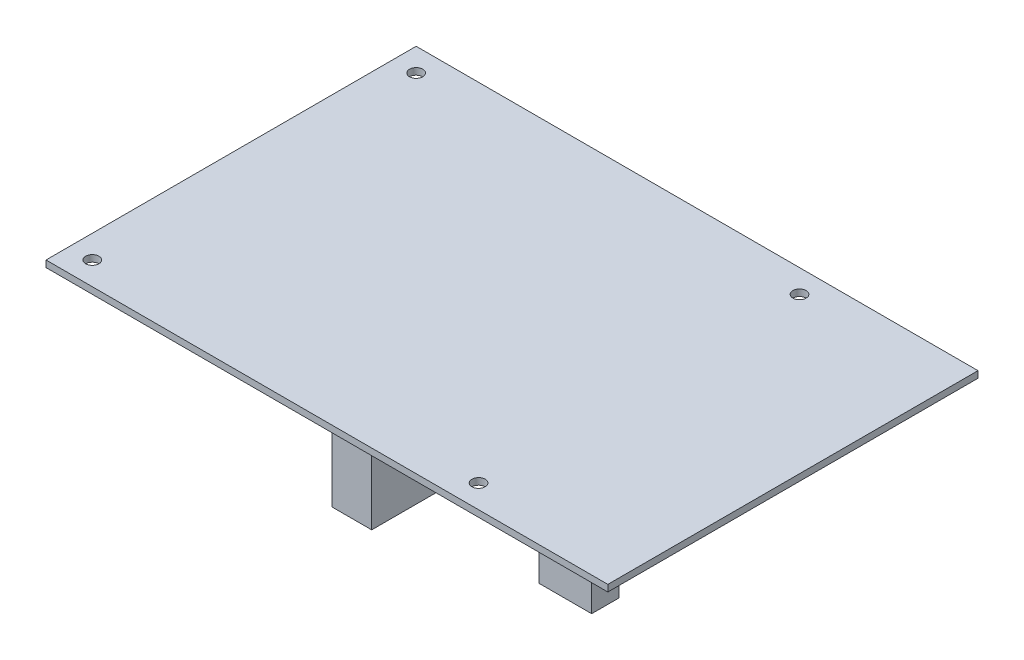
ISO-10303-21;
HEADER;
FILE_DESCRIPTION(('STEP AP214'),'2;1');
FILE_NAME('part.step','',(''),(''),'','','');
FILE_SCHEMA(('AUTOMOTIVE_DESIGN { 1 0 10303 214 1 1 1 1 }'));
ENDSEC;
DATA;
#1=APPLICATION_CONTEXT('core data for automotive mechanical design processes');
#2=APPLICATION_PROTOCOL_DEFINITION('international standard','automotive_design',2000,#1);
#3=PRODUCT_CONTEXT('',#1,'mechanical');
#4=PRODUCT('Part','Part','',(#3));
#5=PRODUCT_RELATED_PRODUCT_CATEGORY('part','',(#4));
#6=PRODUCT_DEFINITION_FORMATION('','',#4);
#7=PRODUCT_DEFINITION_CONTEXT('part definition',#1,'design');
#8=PRODUCT_DEFINITION('design','',#6,#7);
#9=PRODUCT_DEFINITION_SHAPE('','',#8);
#10=(LENGTH_UNIT() NAMED_UNIT(*) SI_UNIT(.MILLI.,.METRE.));
#11=(NAMED_UNIT(*) PLANE_ANGLE_UNIT() SI_UNIT($,.RADIAN.));
#12=(NAMED_UNIT(*) SI_UNIT($,.STERADIAN.) SOLID_ANGLE_UNIT());
#13=UNCERTAINTY_MEASURE_WITH_UNIT(LENGTH_MEASURE(1.E-05),#10,'distance_accuracy_value','');
#14=(GEOMETRIC_REPRESENTATION_CONTEXT(3) GLOBAL_UNCERTAINTY_ASSIGNED_CONTEXT((#13)) GLOBAL_UNIT_ASSIGNED_CONTEXT((#10,
#11,#12)) REPRESENTATION_CONTEXT('',''));
#15=CARTESIAN_POINT('',(0.,0.,0.));
#16=DIRECTION('',(0.,0.,1.));
#17=DIRECTION('',(1.,0.,0.));
#18=AXIS2_PLACEMENT_3D('',#15,#16,#17);
#19=CARTESIAN_POINT('',(0.,0.,0.));
#20=DIRECTION('',(0.,1.,0.));
#21=DIRECTION('',(0.,0.,1.));
#22=AXIS2_PLACEMENT_3D('',#19,#20,#21);
#23=PLANE('',#22);
#24=DIRECTION('',(0.,0.,-1.));
#25=VECTOR('',#24,1.);
#26=CARTESIAN_POINT('',(11.0512100100131,0.,12.8774287726198));
#27=LINE('',#26,#25);
#28=CARTESIAN_POINT('',(11.0512100100131,0.,3.73112385895911));
#29=VERTEX_POINT('',#28);
#30=CARTESIAN_POINT('',(11.0512100100131,0.,17.8774287726198));
#31=VERTEX_POINT('',#30);
#32=EDGE_CURVE('E264',#29,#31,#27,.F.);
#33=ORIENTED_EDGE('',*,*,#32,.T.);
#34=DIRECTION('',(-1.,0.,0.));
#35=VECTOR('',#34,1.);
#36=CARTESIAN_POINT('',(24.0512100100131,0.,17.8774287726198));
#37=LINE('',#36,#35);
#38=CARTESIAN_POINT('',(29.0512100100131,0.,17.8774287726198));
#39=VERTEX_POINT('',#38);
#40=EDGE_CURVE('E268',#31,#39,#37,.F.);
#41=ORIENTED_EDGE('',*,*,#40,.T.);
#42=DIRECTION('',(0.,0.,1.));
#43=VECTOR('',#42,1.);
#44=CARTESIAN_POINT('',(29.0512100100131,0.,8.73112385895911));
#45=LINE('',#44,#43);
#46=CARTESIAN_POINT('',(29.0512100100131,0.,3.73112385895911));
#47=VERTEX_POINT('',#46);
#48=EDGE_CURVE('E266',#39,#47,#45,.F.);
#49=ORIENTED_EDGE('',*,*,#48,.T.);
#50=DIRECTION('',(1.,0.,0.));
#51=VECTOR('',#50,1.);
#52=CARTESIAN_POINT('',(16.0512100100131,0.,3.73112385895911));
#53=LINE('',#52,#51);
#54=EDGE_CURVE('E262',#47,#29,#53,.F.);
#55=ORIENTED_EDGE('',*,*,#54,.T.);
#56=EDGE_LOOP('',(#33,#41,#49,#55));
#57=FACE_BOUND('',#56,.T.);
#58=DIRECTION('',(0.,0.,1.));
#59=VECTOR('',#58,1.);
#60=CARTESIAN_POINT('',(1.42598684210526,0.,3.07707170396727));
#61=LINE('',#60,#59);
#62=CARTESIAN_POINT('',(1.42598684210526,0.,23.5314809276117));
#63=VERTEX_POINT('',#62);
#64=CARTESIAN_POINT('',(1.42598684210526,0.,-1.92292829603273));
#65=VERTEX_POINT('',#64);
#66=EDGE_CURVE('E255',#63,#65,#61,.F.);
#67=ORIENTED_EDGE('',*,*,#66,.T.);
#68=DIRECTION('',(1.,0.,0.));
#69=VECTOR('',#68,1.);
#70=CARTESIAN_POINT('',(-9.57401315789475,0.,-1.92292829603273));
#71=LINE('',#70,#69);
#72=CARTESIAN_POINT('',(-14.5740131578947,0.,-1.92292829603273));
#73=VERTEX_POINT('',#72);
#74=EDGE_CURVE('E259',#65,#73,#71,.F.);
#75=ORIENTED_EDGE('',*,*,#74,.T.);
#76=DIRECTION('',(0.,0.,-1.));
#77=VECTOR('',#76,1.);
#78=CARTESIAN_POINT('',(-14.5740131578947,0.,18.5314809276117));
#79=LINE('',#78,#77);
#80=CARTESIAN_POINT('',(-14.5740131578947,0.,23.5314809276117));
#81=VERTEX_POINT('',#80);
#82=EDGE_CURVE('E257',#73,#81,#79,.F.);
#83=ORIENTED_EDGE('',*,*,#82,.T.);
#84=DIRECTION('',(-1.,0.,0.));
#85=VECTOR('',#84,1.);
#86=CARTESIAN_POINT('',(-3.57401315789474,0.,23.5314809276117));
#87=LINE('',#86,#85);
#88=EDGE_CURVE('E253',#81,#63,#87,.F.);
#89=ORIENTED_EDGE('',*,*,#88,.T.);
#90=EDGE_LOOP('',(#67,#75,#83,#89));
#91=FACE_BOUND('',#90,.T.);
#92=DIRECTION('',(0.,0.,1.));
#93=VECTOR('',#92,1.);
#94=CARTESIAN_POINT('',(-32.5740131578947,0.,-17.1957236842105));
#95=LINE('',#94,#93);
#96=CARTESIAN_POINT('',(-32.5740131578947,0.,-17.1957236842105));
#97=VERTEX_POINT('',#96);
#98=CARTESIAN_POINT('',(-32.5740131578947,0.,38.8042763157895));
#99=VERTEX_POINT('',#98);
#100=EDGE_CURVE('E218',#97,#99,#95,.T.);
#101=ORIENTED_EDGE('',*,*,#100,.F.);
#102=DIRECTION('',(-1.,0.,0.));
#103=VECTOR('',#102,1.);
#104=CARTESIAN_POINT('',(-32.5740131578947,0.,-17.1957236842105));
#105=LINE('',#104,#103);
#106=CARTESIAN_POINT('',(52.4259868421053,0.,-17.1957236842105));
#107=VERTEX_POINT('',#106);
#108=EDGE_CURVE('E225',#107,#97,#105,.T.);
#109=ORIENTED_EDGE('',*,*,#108,.F.);
#110=DIRECTION('',(0.,0.,-1.));
#111=VECTOR('',#110,1.);
#112=CARTESIAN_POINT('',(52.4259868421053,0.,-17.1957236842105));
#113=LINE('',#112,#111);
#114=CARTESIAN_POINT('',(52.4259868421053,0.,38.8042763157895));
#115=VERTEX_POINT('',#114);
#116=EDGE_CURVE('E236',#115,#107,#113,.T.);
#117=ORIENTED_EDGE('',*,*,#116,.F.);
#118=DIRECTION('',(1.,0.,0.));
#119=VECTOR('',#118,1.);
#120=CARTESIAN_POINT('',(-32.5740131578947,0.,38.8042763157895));
#121=LINE('',#120,#119);
#122=EDGE_CURVE('E234',#99,#115,#121,.T.);
#123=ORIENTED_EDGE('',*,*,#122,.F.);
#124=EDGE_LOOP('',(#101,#109,#117,#123));
#125=FACE_BOUND('',#124,.T.);
#126=CARTESIAN_POINT('',(-29.0740131578947,0.,-13.6957236842105));
#127=DIRECTION('',(0.,1.,0.));
#128=DIRECTION('',(0.,0.,1.));
#129=AXIS2_PLACEMENT_3D('',#126,#127,#128);
#130=CIRCLE('',#129,1.);
#131=CARTESIAN_POINT('',(-29.0740131578947,0.,-12.6957236842105));
#132=VERTEX_POINT('',#131);
#133=EDGE_CURVE('E212',#132,#132,#130,.T.);
#134=ORIENTED_EDGE('',*,*,#133,.T.);
#135=EDGE_LOOP('',(#134));
#136=FACE_BOUND('',#135,.T.);
#137=CARTESIAN_POINT('',(28.9259868421053,0.,-13.6957236842105));
#138=DIRECTION('',(0.,1.,0.));
#139=DIRECTION('',(0.,0.,1.));
#140=AXIS2_PLACEMENT_3D('',#137,#138,#139);
#141=CIRCLE('',#140,0.999999999999998);
#142=CARTESIAN_POINT('',(28.9259868421053,0.,-12.6957236842105));
#143=VERTEX_POINT('',#142);
#144=EDGE_CURVE('E206',#143,#143,#141,.T.);
#145=ORIENTED_EDGE('',*,*,#144,.T.);
#146=EDGE_LOOP('',(#145));
#147=FACE_BOUND('',#146,.T.);
#148=CARTESIAN_POINT('',(29.3634868421053,0.,35.3042763157895));
#149=DIRECTION('',(0.,1.,0.));
#150=DIRECTION('',(0.,0.,1.));
#151=AXIS2_PLACEMENT_3D('',#148,#149,#150);
#152=CIRCLE('',#151,0.999999999999998);
#153=CARTESIAN_POINT('',(29.3634868421053,0.,36.3042763157895));
#154=VERTEX_POINT('',#153);
#155=EDGE_CURVE('E200',#154,#154,#152,.T.);
#156=ORIENTED_EDGE('',*,*,#155,.T.);
#157=EDGE_LOOP('',(#156));
#158=FACE_BOUND('',#157,.T.);
#159=CARTESIAN_POINT('',(-29.0740131578947,0.,35.3042763157895));
#160=DIRECTION('',(0.,1.,0.));
#161=DIRECTION('',(0.,0.,1.));
#162=AXIS2_PLACEMENT_3D('',#159,#160,#161);
#163=CIRCLE('',#162,1.);
#164=CARTESIAN_POINT('',(-29.0740131578947,0.,36.3042763157895));
#165=VERTEX_POINT('',#164);
#166=EDGE_CURVE('E196',#165,#165,#163,.T.);
#167=ORIENTED_EDGE('',*,*,#166,.T.);
#168=EDGE_LOOP('',(#167));
#169=FACE_BOUND('',#168,.T.);
#170=ADVANCED_FACE('F33',(#57,#91,#125,#136,#147,#158,#169),#23,.F.);
#171=CARTESIAN_POINT('',(0.,1.,0.));
#172=DIRECTION('',(0.,1.,0.));
#173=DIRECTION('',(0.,0.,1.));
#174=AXIS2_PLACEMENT_3D('',#171,#172,#173);
#175=PLANE('',#174);
#176=CARTESIAN_POINT('',(29.3634868421053,1.,35.3042763157895));
#177=DIRECTION('',(0.,1.,0.));
#178=DIRECTION('',(0.,0.,1.));
#179=AXIS2_PLACEMENT_3D('',#176,#177,#178);
#180=CIRCLE('',#179,0.999999999999998);
#181=CARTESIAN_POINT('',(29.3634868421053,1.,36.3042763157895));
#182=VERTEX_POINT('',#181);
#183=EDGE_CURVE('E203',#182,#182,#180,.T.);
#184=ORIENTED_EDGE('',*,*,#183,.F.);
#185=EDGE_LOOP('',(#184));
#186=FACE_BOUND('',#185,.T.);
#187=CARTESIAN_POINT('',(-29.0740131578947,1.,-13.6957236842105));
#188=DIRECTION('',(0.,1.,0.));
#189=DIRECTION('',(0.,0.,1.));
#190=AXIS2_PLACEMENT_3D('',#187,#188,#189);
#191=CIRCLE('',#190,1.);
#192=CARTESIAN_POINT('',(-29.0740131578947,1.,-12.6957236842105));
#193=VERTEX_POINT('',#192);
#194=EDGE_CURVE('E215',#193,#193,#191,.T.);
#195=ORIENTED_EDGE('',*,*,#194,.F.);
#196=EDGE_LOOP('',(#195));
#197=FACE_BOUND('',#196,.T.);
#198=DIRECTION('',(0.,0.,1.));
#199=VECTOR('',#198,1.);
#200=CARTESIAN_POINT('',(-32.5740131578947,1.,-17.1957236842105));
#201=LINE('',#200,#199);
#202=CARTESIAN_POINT('',(-32.5740131578947,1.,-17.1957236842105));
#203=VERTEX_POINT('',#202);
#204=CARTESIAN_POINT('',(-32.5740131578947,1.,38.8042763157895));
#205=VERTEX_POINT('',#204);
#206=EDGE_CURVE('E221',#203,#205,#201,.T.);
#207=ORIENTED_EDGE('',*,*,#206,.T.);
#208=DIRECTION('',(1.,0.,0.));
#209=VECTOR('',#208,1.);
#210=CARTESIAN_POINT('',(-32.5740131578947,1.,38.8042763157895));
#211=LINE('',#210,#209);
#212=CARTESIAN_POINT('',(52.4259868421053,1.,38.8042763157895));
#213=VERTEX_POINT('',#212);
#214=EDGE_CURVE('E224',#205,#213,#211,.T.);
#215=ORIENTED_EDGE('',*,*,#214,.T.);
#216=DIRECTION('',(0.,0.,-1.));
#217=VECTOR('',#216,1.);
#218=CARTESIAN_POINT('',(52.4259868421053,1.,-17.1957236842105));
#219=LINE('',#218,#217);
#220=CARTESIAN_POINT('',(52.4259868421053,1.,-17.1957236842105));
#221=VERTEX_POINT('',#220);
#222=EDGE_CURVE('E227',#213,#221,#219,.T.);
#223=ORIENTED_EDGE('',*,*,#222,.T.);
#224=DIRECTION('',(-1.,0.,0.));
#225=VECTOR('',#224,1.);
#226=CARTESIAN_POINT('',(-32.5740131578947,1.,-17.1957236842105));
#227=LINE('',#226,#225);
#228=EDGE_CURVE('E229',#221,#203,#227,.T.);
#229=ORIENTED_EDGE('',*,*,#228,.T.);
#230=EDGE_LOOP('',(#207,#215,#223,#229));
#231=FACE_BOUND('',#230,.T.);
#232=CARTESIAN_POINT('',(28.9259868421053,1.,-13.6957236842105));
#233=DIRECTION('',(0.,1.,0.));
#234=DIRECTION('',(0.,0.,1.));
#235=AXIS2_PLACEMENT_3D('',#232,#233,#234);
#236=CIRCLE('',#235,0.999999999999998);
#237=CARTESIAN_POINT('',(28.9259868421053,1.,-12.6957236842105));
#238=VERTEX_POINT('',#237);
#239=EDGE_CURVE('E209',#238,#238,#236,.T.);
#240=ORIENTED_EDGE('',*,*,#239,.F.);
#241=EDGE_LOOP('',(#240));
#242=FACE_BOUND('',#241,.T.);
#243=CARTESIAN_POINT('',(-29.0740131578947,1.,35.3042763157895));
#244=DIRECTION('',(0.,1.,0.));
#245=DIRECTION('',(0.,0.,1.));
#246=AXIS2_PLACEMENT_3D('',#243,#244,#245);
#247=CIRCLE('',#246,1.);
#248=CARTESIAN_POINT('',(-29.0740131578947,1.,36.3042763157895));
#249=VERTEX_POINT('',#248);
#250=EDGE_CURVE('E197',#249,#249,#247,.T.);
#251=ORIENTED_EDGE('',*,*,#250,.F.);
#252=EDGE_LOOP('',(#251));
#253=FACE_BOUND('',#252,.T.);
#254=ADVANCED_FACE('F340',(#186,#197,#231,#242,#253),#175,.T.);
#255=CARTESIAN_POINT('',(-32.5740131578947,1.,-17.1957236842105));
#256=DIRECTION('',(1.,0.,0.));
#257=DIRECTION('',(0.,0.,-1.));
#258=AXIS2_PLACEMENT_3D('',#255,#256,#257);
#259=PLANE('',#258);
#260=ORIENTED_EDGE('',*,*,#100,.T.);
#261=DIRECTION('',(0.,-1.,0.));
#262=VECTOR('',#261,1.);
#263=CARTESIAN_POINT('',(-32.5740131578947,1.,38.8042763157895));
#264=LINE('',#263,#262);
#265=EDGE_CURVE('E247',#205,#99,#264,.T.);
#266=ORIENTED_EDGE('',*,*,#265,.F.);
#267=ORIENTED_EDGE('',*,*,#206,.F.);
#268=DIRECTION('',(0.,-1.,0.));
#269=VECTOR('',#268,1.);
#270=CARTESIAN_POINT('',(-32.5740131578947,1.,-17.1957236842105));
#271=LINE('',#270,#269);
#272=EDGE_CURVE('E231',#203,#97,#271,.T.);
#273=ORIENTED_EDGE('',*,*,#272,.T.);
#274=EDGE_LOOP('',(#260,#266,#267,#273));
#275=FACE_BOUND('',#274,.T.);
#276=ADVANCED_FACE('F346',(#275),#259,.F.);
#277=CARTESIAN_POINT('',(-32.5740131578947,1.,38.8042763157895));
#278=DIRECTION('',(0.,0.,-1.));
#279=DIRECTION('',(-1.,0.,0.));
#280=AXIS2_PLACEMENT_3D('',#277,#278,#279);
#281=PLANE('',#280);
#282=ORIENTED_EDGE('',*,*,#122,.T.);
#283=DIRECTION('',(0.,-1.,0.));
#284=VECTOR('',#283,1.);
#285=CARTESIAN_POINT('',(52.4259868421053,1.,38.8042763157895));
#286=LINE('',#285,#284);
#287=EDGE_CURVE('E244',#213,#115,#286,.T.);
#288=ORIENTED_EDGE('',*,*,#287,.F.);
#289=ORIENTED_EDGE('',*,*,#214,.F.);
#290=ORIENTED_EDGE('',*,*,#265,.T.);
#291=EDGE_LOOP('',(#282,#288,#289,#290));
#292=FACE_BOUND('',#291,.T.);
#293=ADVANCED_FACE('F359',(#292),#281,.F.);
#294=CARTESIAN_POINT('',(52.4259868421053,1.,-17.1957236842105));
#295=DIRECTION('',(-1.,0.,0.));
#296=DIRECTION('',(0.,0.,1.));
#297=AXIS2_PLACEMENT_3D('',#294,#295,#296);
#298=PLANE('',#297);
#299=ORIENTED_EDGE('',*,*,#116,.T.);
#300=DIRECTION('',(0.,-1.,0.));
#301=VECTOR('',#300,1.);
#302=CARTESIAN_POINT('',(52.4259868421053,1.,-17.1957236842105));
#303=LINE('',#302,#301);
#304=EDGE_CURVE('E241',#221,#107,#303,.T.);
#305=ORIENTED_EDGE('',*,*,#304,.F.);
#306=ORIENTED_EDGE('',*,*,#222,.F.);
#307=ORIENTED_EDGE('',*,*,#287,.T.);
#308=EDGE_LOOP('',(#299,#305,#306,#307));
#309=FACE_BOUND('',#308,.T.);
#310=ADVANCED_FACE('F355',(#309),#298,.F.);
#311=CARTESIAN_POINT('',(-32.5740131578947,1.,-17.1957236842105));
#312=DIRECTION('',(0.,0.,1.));
#313=DIRECTION('',(1.,0.,0.));
#314=AXIS2_PLACEMENT_3D('',#311,#312,#313);
#315=PLANE('',#314);
#316=ORIENTED_EDGE('',*,*,#108,.T.);
#317=ORIENTED_EDGE('',*,*,#272,.F.);
#318=ORIENTED_EDGE('',*,*,#228,.F.);
#319=ORIENTED_EDGE('',*,*,#304,.T.);
#320=EDGE_LOOP('',(#316,#317,#318,#319));
#321=FACE_BOUND('',#320,.T.);
#322=ADVANCED_FACE('F351',(#321),#315,.F.);
#323=CARTESIAN_POINT('',(-29.0740131578947,1.,-13.6957236842105));
#324=DIRECTION('',(0.,-1.,0.));
#325=DIRECTION('',(0.,0.,-1.));
#326=AXIS2_PLACEMENT_3D('',#323,#324,#325);
#327=CYLINDRICAL_SURFACE('',#326,1.);
#328=ORIENTED_EDGE('',*,*,#194,.T.);
#329=EDGE_LOOP('',(#328));
#330=FACE_BOUND('',#329,.T.);
#331=ORIENTED_EDGE('',*,*,#133,.F.);
#332=EDGE_LOOP('',(#331));
#333=FACE_BOUND('',#332,.T.);
#334=ADVANCED_FACE('F354',(#330,#333),#327,.F.);
#335=CARTESIAN_POINT('',(28.9259868421053,1.,-13.6957236842105));
#336=DIRECTION('',(0.,-1.,0.));
#337=DIRECTION('',(0.,0.,-1.));
#338=AXIS2_PLACEMENT_3D('',#335,#336,#337);
#339=CYLINDRICAL_SURFACE('',#338,0.999999999999998);
#340=ORIENTED_EDGE('',*,*,#239,.T.);
#341=EDGE_LOOP('',(#340));
#342=FACE_BOUND('',#341,.T.);
#343=ORIENTED_EDGE('',*,*,#144,.F.);
#344=EDGE_LOOP('',(#343));
#345=FACE_BOUND('',#344,.T.);
#346=ADVANCED_FACE('F603',(#342,#345),#339,.F.);
#347=CARTESIAN_POINT('',(29.3634868421053,1.,35.3042763157895));
#348=DIRECTION('',(0.,-1.,0.));
#349=DIRECTION('',(0.,0.,-1.));
#350=AXIS2_PLACEMENT_3D('',#347,#348,#349);
#351=CYLINDRICAL_SURFACE('',#350,0.999999999999998);
#352=ORIENTED_EDGE('',*,*,#183,.T.);
#353=EDGE_LOOP('',(#352));
#354=FACE_BOUND('',#353,.T.);
#355=ORIENTED_EDGE('',*,*,#155,.F.);
#356=EDGE_LOOP('',(#355));
#357=FACE_BOUND('',#356,.T.);
#358=ADVANCED_FACE('F594',(#354,#357),#351,.F.);
#359=CARTESIAN_POINT('',(-29.0740131578947,1.,35.3042763157895));
#360=DIRECTION('',(0.,-1.,0.));
#361=DIRECTION('',(0.,0.,-1.));
#362=AXIS2_PLACEMENT_3D('',#359,#360,#361);
#363=CYLINDRICAL_SURFACE('',#362,1.);
#364=ORIENTED_EDGE('',*,*,#250,.T.);
#365=EDGE_LOOP('',(#364));
#366=FACE_BOUND('',#365,.T.);
#367=ORIENTED_EDGE('',*,*,#166,.F.);
#368=EDGE_LOOP('',(#367));
#369=FACE_BOUND('',#368,.T.);
#370=ADVANCED_FACE('F583',(#366,#369),#363,.F.);
#371=CARTESIAN_POINT('',(-9.57401315789475,-30.,18.5314809276117));
#372=DIRECTION('',(1.,0.,0.));
#373=DIRECTION('',(0.,0.,-1.));
#374=AXIS2_PLACEMENT_3D('',#371,#372,#373);
#375=PLANE('',#374);
#376=DIRECTION('',(0.,1.,0.));
#377=VECTOR('',#376,1.);
#378=CARTESIAN_POINT('',(-9.57401315789475,-30.,18.5314809276117));
#379=LINE('',#378,#377);
#380=CARTESIAN_POINT('',(-9.57401315789475,-30.,18.5314809276117));
#381=VERTEX_POINT('',#380);
#382=CARTESIAN_POINT('',(-9.57401315789475,-5.,18.5314809276117));
#383=VERTEX_POINT('',#382);
#384=EDGE_CURVE('E187',#381,#383,#379,.T.);
#385=ORIENTED_EDGE('',*,*,#384,.T.);
#386=DIRECTION('',(0.,0.,-1.));
#387=VECTOR('',#386,1.);
#388=CARTESIAN_POINT('',(-9.57401315789475,-5.,3.07707170396727));
#389=LINE('',#388,#387);
#390=CARTESIAN_POINT('',(-9.57401315789475,-5.,3.07707170396727));
#391=VERTEX_POINT('',#390);
#392=EDGE_CURVE('E279',#383,#391,#389,.T.);
#393=ORIENTED_EDGE('',*,*,#392,.T.);
#394=DIRECTION('',(0.,1.,0.));
#395=VECTOR('',#394,1.);
#396=CARTESIAN_POINT('',(-9.57401315789475,-30.,3.07707170396727));
#397=LINE('',#396,#395);
#398=CARTESIAN_POINT('',(-9.57401315789475,-30.,3.07707170396727));
#399=VERTEX_POINT('',#398);
#400=EDGE_CURVE('E193',#399,#391,#397,.T.);
#401=ORIENTED_EDGE('',*,*,#400,.F.);
#402=DIRECTION('',(0.,0.,-1.));
#403=VECTOR('',#402,1.);
#404=CARTESIAN_POINT('',(-9.57401315789475,-30.,18.5314809276117));
#405=LINE('',#404,#403);
#406=EDGE_CURVE('E173',#381,#399,#405,.T.);
#407=ORIENTED_EDGE('',*,*,#406,.F.);
#408=EDGE_LOOP('',(#385,#393,#401,#407));
#409=FACE_BOUND('',#408,.T.);
#410=ADVANCED_FACE('F328',(#409),#375,.F.);
#411=CARTESIAN_POINT('',(-9.57401315789475,-30.,3.07707170396727));
#412=DIRECTION('',(0.,0.,1.));
#413=DIRECTION('',(1.,0.,0.));
#414=AXIS2_PLACEMENT_3D('',#411,#412,#413);
#415=PLANE('',#414);
#416=ORIENTED_EDGE('',*,*,#400,.T.);
#417=DIRECTION('',(1.,0.,0.));
#418=VECTOR('',#417,1.);
#419=CARTESIAN_POINT('',(-3.57401315789474,-5.,3.07707170396727));
#420=LINE('',#419,#418);
#421=CARTESIAN_POINT('',(-3.57401315789474,-5.,3.07707170396727));
#422=VERTEX_POINT('',#421);
#423=EDGE_CURVE('E276',#391,#422,#420,.T.);
#424=ORIENTED_EDGE('',*,*,#423,.T.);
#425=DIRECTION('',(0.,1.,0.));
#426=VECTOR('',#425,1.);
#427=CARTESIAN_POINT('',(-3.57401315789474,-30.,3.07707170396727));
#428=LINE('',#427,#426);
#429=CARTESIAN_POINT('',(-3.57401315789474,-30.,3.07707170396727));
#430=VERTEX_POINT('',#429);
#431=EDGE_CURVE('E191',#430,#422,#428,.T.);
#432=ORIENTED_EDGE('',*,*,#431,.F.);
#433=DIRECTION('',(1.,0.,0.));
#434=VECTOR('',#433,1.);
#435=CARTESIAN_POINT('',(-9.57401315789475,-30.,3.07707170396727));
#436=LINE('',#435,#434);
#437=EDGE_CURVE('E176',#399,#430,#436,.T.);
#438=ORIENTED_EDGE('',*,*,#437,.F.);
#439=EDGE_LOOP('',(#416,#424,#432,#438));
#440=FACE_BOUND('',#439,.T.);
#441=ADVANCED_FACE('F319',(#440),#415,.F.);
#442=CARTESIAN_POINT('',(-3.57401315789474,-30.,18.5314809276117));
#443=DIRECTION('',(-1.,0.,0.));
#444=DIRECTION('',(0.,0.,1.));
#445=AXIS2_PLACEMENT_3D('',#442,#443,#444);
#446=PLANE('',#445);
#447=ORIENTED_EDGE('',*,*,#431,.T.);
#448=DIRECTION('',(0.,0.,1.));
#449=VECTOR('',#448,1.);
#450=CARTESIAN_POINT('',(-3.57401315789474,-5.,18.5314809276117));
#451=LINE('',#450,#449);
#452=CARTESIAN_POINT('',(-3.57401315789474,-5.,18.5314809276117));
#453=VERTEX_POINT('',#452);
#454=EDGE_CURVE('E42',#422,#453,#451,.T.);
#455=ORIENTED_EDGE('',*,*,#454,.T.);
#456=DIRECTION('',(0.,1.,0.));
#457=VECTOR('',#456,1.);
#458=CARTESIAN_POINT('',(-3.57401315789474,-30.,18.5314809276117));
#459=LINE('',#458,#457);
#460=CARTESIAN_POINT('',(-3.57401315789474,-30.,18.5314809276117));
#461=VERTEX_POINT('',#460);
#462=EDGE_CURVE('E189',#461,#453,#459,.T.);
#463=ORIENTED_EDGE('',*,*,#462,.F.);
#464=DIRECTION('',(0.,0.,1.));
#465=VECTOR('',#464,1.);
#466=CARTESIAN_POINT('',(-3.57401315789474,-30.,18.5314809276117));
#467=LINE('',#466,#465);
#468=EDGE_CURVE('E183',#430,#461,#467,.T.);
#469=ORIENTED_EDGE('',*,*,#468,.F.);
#470=EDGE_LOOP('',(#447,#455,#463,#469));
#471=FACE_BOUND('',#470,.T.);
#472=ADVANCED_FACE('F322',(#471),#446,.F.);
#473=CARTESIAN_POINT('',(-9.57401315789475,-30.,18.5314809276117));
#474=DIRECTION('',(0.,0.,-1.));
#475=DIRECTION('',(-1.,0.,0.));
#476=AXIS2_PLACEMENT_3D('',#473,#474,#475);
#477=PLANE('',#476);
#478=ORIENTED_EDGE('',*,*,#462,.T.);
#479=DIRECTION('',(-1.,0.,0.));
#480=VECTOR('',#479,1.);
#481=CARTESIAN_POINT('',(-9.57401315789475,-5.,18.5314809276117));
#482=LINE('',#481,#480);
#483=EDGE_CURVE('E11',#453,#383,#482,.T.);
#484=ORIENTED_EDGE('',*,*,#483,.T.);
#485=ORIENTED_EDGE('',*,*,#384,.F.);
#486=DIRECTION('',(-1.,0.,0.));
#487=VECTOR('',#486,1.);
#488=CARTESIAN_POINT('',(-9.57401315789475,-30.,18.5314809276117));
#489=LINE('',#488,#487);
#490=EDGE_CURVE('E185',#461,#381,#489,.T.);
#491=ORIENTED_EDGE('',*,*,#490,.F.);
#492=EDGE_LOOP('',(#478,#484,#485,#491));
#493=FACE_BOUND('',#492,.T.);
#494=ADVANCED_FACE('F329',(#493),#477,.F.);
#495=CARTESIAN_POINT('',(0.,-30.,0.));
#496=DIRECTION('',(0.,-1.,0.));
#497=DIRECTION('',(0.,0.,-1.));
#498=AXIS2_PLACEMENT_3D('',#495,#496,#497);
#499=PLANE('',#498);
#500=CARTESIAN_POINT('',(-6.57401315789474,-30.,14.3042763157895));
#501=DIRECTION('',(0.,-1.,0.));
#502=DIRECTION('',(0.,0.,-1.));
#503=AXIS2_PLACEMENT_3D('',#500,#501,#502);
#504=CIRCLE('',#503,0.85);
#505=CARTESIAN_POINT('',(-6.57401315789474,-30.,13.4542763157895));
#506=VERTEX_POINT('',#505);
#507=EDGE_CURVE('E498',#506,#506,#504,.T.);
#508=ORIENTED_EDGE('',*,*,#507,.F.);
#509=EDGE_LOOP('',(#508));
#510=FACE_BOUND('',#509,.T.);
#511=CARTESIAN_POINT('',(-6.57401315789474,-30.,7.30427631578947));
#512=DIRECTION('',(0.,-1.,0.));
#513=DIRECTION('',(0.,0.,-1.));
#514=AXIS2_PLACEMENT_3D('',#511,#512,#513);
#515=CIRCLE('',#514,0.85);
#516=CARTESIAN_POINT('',(-6.57401315789474,-30.,6.45427631578947));
#517=VERTEX_POINT('',#516);
#518=EDGE_CURVE('E506',#517,#517,#515,.T.);
#519=ORIENTED_EDGE('',*,*,#518,.F.);
#520=EDGE_LOOP('',(#519));
#521=FACE_BOUND('',#520,.T.);
#522=ORIENTED_EDGE('',*,*,#406,.T.);
#523=ORIENTED_EDGE('',*,*,#437,.T.);
#524=ORIENTED_EDGE('',*,*,#468,.T.);
#525=ORIENTED_EDGE('',*,*,#490,.T.);
#526=EDGE_LOOP('',(#522,#523,#524,#525));
#527=FACE_BOUND('',#526,.T.);
#528=ADVANCED_FACE('F325',(#510,#521,#527),#499,.T.);
#529=CARTESIAN_POINT('',(16.0512100100131,-30.,12.8774287726198));
#530=DIRECTION('',(1.,0.,0.));
#531=DIRECTION('',(0.,0.,-1.));
#532=AXIS2_PLACEMENT_3D('',#529,#530,#531);
#533=PLANE('',#532);
#534=DIRECTION('',(0.,1.,0.));
#535=VECTOR('',#534,1.);
#536=CARTESIAN_POINT('',(16.0512100100131,-30.,12.8774287726198));
#537=LINE('',#536,#535);
#538=CARTESIAN_POINT('',(16.0512100100131,-30.,12.8774287726198));
#539=VERTEX_POINT('',#538);
#540=CARTESIAN_POINT('',(16.0512100100131,-5.,12.8774287726198));
#541=VERTEX_POINT('',#540);
#542=EDGE_CURVE('E511',#539,#541,#537,.T.);
#543=ORIENTED_EDGE('',*,*,#542,.T.);
#544=DIRECTION('',(0.,0.,-1.));
#545=VECTOR('',#544,1.);
#546=CARTESIAN_POINT('',(16.0512100100131,-5.,8.73112385895911));
#547=LINE('',#546,#545);
#548=CARTESIAN_POINT('',(16.0512100100131,-5.,8.73112385895911));
#549=VERTEX_POINT('',#548);
#550=EDGE_CURVE('E172',#541,#549,#547,.T.);
#551=ORIENTED_EDGE('',*,*,#550,.T.);
#552=DIRECTION('',(0.,1.,0.));
#553=VECTOR('',#552,1.);
#554=CARTESIAN_POINT('',(16.0512100100131,-30.,8.73112385895911));
#555=LINE('',#554,#553);
#556=CARTESIAN_POINT('',(16.0512100100131,-30.,8.73112385895911));
#557=VERTEX_POINT('',#556);
#558=EDGE_CURVE('E152',#557,#549,#555,.T.);
#559=ORIENTED_EDGE('',*,*,#558,.F.);
#560=DIRECTION('',(0.,0.,-1.));
#561=VECTOR('',#560,1.);
#562=CARTESIAN_POINT('',(16.0512100100131,-30.,12.8774287726198));
#563=LINE('',#562,#561);
#564=EDGE_CURVE('E159',#539,#557,#563,.T.);
#565=ORIENTED_EDGE('',*,*,#564,.F.);
#566=EDGE_LOOP('',(#543,#551,#559,#565));
#567=FACE_BOUND('',#566,.T.);
#568=ADVANCED_FACE('F170',(#567),#533,.F.);
#569=CARTESIAN_POINT('',(16.0512100100131,-30.,8.73112385895911));
#570=DIRECTION('',(0.,0.,1.));
#571=DIRECTION('',(1.,0.,0.));
#572=AXIS2_PLACEMENT_3D('',#569,#570,#571);
#573=PLANE('',#572);
#574=ORIENTED_EDGE('',*,*,#558,.T.);
#575=DIRECTION('',(1.,0.,0.));
#576=VECTOR('',#575,1.);
#577=CARTESIAN_POINT('',(24.0512100100131,-5.,8.73112385895911));
#578=LINE('',#577,#576);
#579=CARTESIAN_POINT('',(24.0512100100131,-5.,8.73112385895911));
#580=VERTEX_POINT('',#579);
#581=EDGE_CURVE('E274',#549,#580,#578,.T.);
#582=ORIENTED_EDGE('',*,*,#581,.T.);
#583=DIRECTION('',(0.,1.,0.));
#584=VECTOR('',#583,1.);
#585=CARTESIAN_POINT('',(24.0512100100131,-30.,8.73112385895911));
#586=LINE('',#585,#584);
#587=CARTESIAN_POINT('',(24.0512100100131,-30.,8.73112385895911));
#588=VERTEX_POINT('',#587);
#589=EDGE_CURVE('E155',#588,#580,#586,.T.);
#590=ORIENTED_EDGE('',*,*,#589,.F.);
#591=DIRECTION('',(1.,0.,0.));
#592=VECTOR('',#591,1.);
#593=CARTESIAN_POINT('',(16.0512100100131,-30.,8.73112385895911));
#594=LINE('',#593,#592);
#595=EDGE_CURVE('E148',#557,#588,#594,.T.);
#596=ORIENTED_EDGE('',*,*,#595,.F.);
#597=EDGE_LOOP('',(#574,#582,#590,#596));
#598=FACE_BOUND('',#597,.T.);
#599=ADVANCED_FACE('F150',(#598),#573,.F.);
#600=CARTESIAN_POINT('',(24.0512100100131,-30.,12.8774287726198));
#601=DIRECTION('',(-1.,0.,0.));
#602=DIRECTION('',(0.,0.,1.));
#603=AXIS2_PLACEMENT_3D('',#600,#601,#602);
#604=PLANE('',#603);
#605=ORIENTED_EDGE('',*,*,#589,.T.);
#606=DIRECTION('',(0.,0.,1.));
#607=VECTOR('',#606,1.);
#608=CARTESIAN_POINT('',(24.0512100100131,-5.,12.8774287726198));
#609=LINE('',#608,#607);
#610=CARTESIAN_POINT('',(24.0512100100131,-5.,12.8774287726198));
#611=VERTEX_POINT('',#610);
#612=EDGE_CURVE('E271',#580,#611,#609,.T.);
#613=ORIENTED_EDGE('',*,*,#612,.T.);
#614=DIRECTION('',(0.,1.,0.));
#615=VECTOR('',#614,1.);
#616=CARTESIAN_POINT('',(24.0512100100131,-30.,12.8774287726198));
#617=LINE('',#616,#615);
#618=CARTESIAN_POINT('',(24.0512100100131,-30.,12.8774287726198));
#619=VERTEX_POINT('',#618);
#620=EDGE_CURVE('E178',#619,#611,#617,.T.);
#621=ORIENTED_EDGE('',*,*,#620,.F.);
#622=DIRECTION('',(0.,0.,1.));
#623=VECTOR('',#622,1.);
#624=CARTESIAN_POINT('',(24.0512100100131,-30.,12.8774287726198));
#625=LINE('',#624,#623);
#626=EDGE_CURVE('E158',#588,#619,#625,.T.);
#627=ORIENTED_EDGE('',*,*,#626,.F.);
#628=EDGE_LOOP('',(#605,#613,#621,#627));
#629=FACE_BOUND('',#628,.T.);
#630=ADVANCED_FACE('F423',(#629),#604,.F.);
#631=CARTESIAN_POINT('',(16.0512100100131,-30.,12.8774287726198));
#632=DIRECTION('',(0.,0.,-1.));
#633=DIRECTION('',(-1.,0.,0.));
#634=AXIS2_PLACEMENT_3D('',#631,#632,#633);
#635=PLANE('',#634);
#636=ORIENTED_EDGE('',*,*,#620,.T.);
#637=DIRECTION('',(-1.,0.,0.));
#638=VECTOR('',#637,1.);
#639=CARTESIAN_POINT('',(16.0512100100131,-5.,12.8774287726198));
#640=LINE('',#639,#638);
#641=EDGE_CURVE('E250',#611,#541,#640,.T.);
#642=ORIENTED_EDGE('',*,*,#641,.T.);
#643=ORIENTED_EDGE('',*,*,#542,.F.);
#644=DIRECTION('',(-1.,0.,0.));
#645=VECTOR('',#644,1.);
#646=CARTESIAN_POINT('',(16.0512100100131,-30.,12.8774287726198));
#647=LINE('',#646,#645);
#648=EDGE_CURVE('E164',#619,#539,#647,.T.);
#649=ORIENTED_EDGE('',*,*,#648,.F.);
#650=EDGE_LOOP('',(#636,#642,#643,#649));
#651=FACE_BOUND('',#650,.T.);
#652=ADVANCED_FACE('F416',(#651),#635,.F.);
#653=CARTESIAN_POINT('',(0.,-30.,0.));
#654=DIRECTION('',(0.,-1.,0.));
#655=DIRECTION('',(0.,0.,-1.));
#656=AXIS2_PLACEMENT_3D('',#653,#654,#655);
#657=PLANE('',#656);
#658=ORIENTED_EDGE('',*,*,#564,.T.);
#659=ORIENTED_EDGE('',*,*,#595,.T.);
#660=ORIENTED_EDGE('',*,*,#626,.T.);
#661=ORIENTED_EDGE('',*,*,#648,.T.);
#662=EDGE_LOOP('',(#658,#659,#660,#661));
#663=FACE_BOUND('',#662,.T.);
#664=ADVANCED_FACE('F162',(#663),#657,.T.);
#665=CARTESIAN_POINT('',(16.0512100100131,-5.,3.73112385895911));
#666=DIRECTION('',(-1.,0.,0.));
#667=DIRECTION('',(0.,0.,1.));
#668=AXIS2_PLACEMENT_3D('',#665,#666,#667);
#669=CYLINDRICAL_SURFACE('',#668,5.);
#670=CARTESIAN_POINT('',(11.0512100100131,-5.,3.73112385895911));
#671=DIRECTION('',(-0.707106781186547,0.,0.707106781186547));
#672=DIRECTION('',(-0.707106781186547,0.,-0.707106781186547));
#673=AXIS2_PLACEMENT_3D('',#670,#671,#672);
#674=ELLIPSE('',#673,7.07106781186547,5.);
#675=EDGE_CURVE('E286',#29,#549,#674,.F.);
#676=ORIENTED_EDGE('',*,*,#675,.F.);
#677=ORIENTED_EDGE('',*,*,#54,.F.);
#678=CARTESIAN_POINT('',(29.0512100100131,-5.,3.73112385895911));
#679=DIRECTION('',(-0.707106781186547,0.,-0.707106781186547));
#680=DIRECTION('',(-0.707106781186547,0.,0.707106781186547));
#681=AXIS2_PLACEMENT_3D('',#678,#679,#680);
#682=ELLIPSE('',#681,7.07106781186547,5.);
#683=EDGE_CURVE('E168',#580,#47,#682,.T.);
#684=ORIENTED_EDGE('',*,*,#683,.F.);
#685=ORIENTED_EDGE('',*,*,#581,.F.);
#686=EDGE_LOOP('',(#676,#677,#684,#685));
#687=FACE_BOUND('',#686,.T.);
#688=ADVANCED_FACE('F378',(#687),#669,.F.);
#689=CARTESIAN_POINT('',(29.0512100100131,-5.,12.8774287726198));
#690=DIRECTION('',(0.,0.,-1.));
#691=DIRECTION('',(-1.,0.,0.));
#692=AXIS2_PLACEMENT_3D('',#689,#690,#691);
#693=CYLINDRICAL_SURFACE('',#692,5.);
#694=ORIENTED_EDGE('',*,*,#683,.T.);
#695=ORIENTED_EDGE('',*,*,#48,.F.);
#696=CARTESIAN_POINT('',(29.0512100100131,-5.,17.8774287726198));
#697=DIRECTION('',(0.707106781186547,0.,-0.707106781186547));
#698=DIRECTION('',(-0.707106781186547,0.,-0.707106781186547));
#699=AXIS2_PLACEMENT_3D('',#696,#697,#698);
#700=ELLIPSE('',#699,7.07106781186547,5.);
#701=EDGE_CURVE('E284',#611,#39,#700,.T.);
#702=ORIENTED_EDGE('',*,*,#701,.F.);
#703=ORIENTED_EDGE('',*,*,#612,.F.);
#704=EDGE_LOOP('',(#694,#695,#702,#703));
#705=FACE_BOUND('',#704,.T.);
#706=ADVANCED_FACE('F374',(#705),#693,.F.);
#707=CARTESIAN_POINT('',(11.0512100100131,-5.,12.8774287726198));
#708=DIRECTION('',(0.,0.,1.));
#709=DIRECTION('',(1.,0.,0.));
#710=AXIS2_PLACEMENT_3D('',#707,#708,#709);
#711=CYLINDRICAL_SURFACE('',#710,5.);
#712=ORIENTED_EDGE('',*,*,#675,.T.);
#713=ORIENTED_EDGE('',*,*,#550,.F.);
#714=CARTESIAN_POINT('',(11.0512100100131,-5.,17.8774287726198));
#715=DIRECTION('',(0.707106781186547,0.,0.707106781186547));
#716=DIRECTION('',(-0.707106781186547,0.,0.707106781186547));
#717=AXIS2_PLACEMENT_3D('',#714,#715,#716);
#718=ELLIPSE('',#717,7.07106781186547,5.);
#719=EDGE_CURVE('E282',#31,#541,#718,.F.);
#720=ORIENTED_EDGE('',*,*,#719,.F.);
#721=ORIENTED_EDGE('',*,*,#32,.F.);
#722=EDGE_LOOP('',(#712,#713,#720,#721));
#723=FACE_BOUND('',#722,.T.);
#724=ADVANCED_FACE('F370',(#723),#711,.F.);
#725=CARTESIAN_POINT('',(16.0512100100131,-5.,17.8774287726198));
#726=DIRECTION('',(1.,0.,0.));
#727=DIRECTION('',(0.,0.,-1.));
#728=AXIS2_PLACEMENT_3D('',#725,#726,#727);
#729=CYLINDRICAL_SURFACE('',#728,5.);
#730=ORIENTED_EDGE('',*,*,#701,.T.);
#731=ORIENTED_EDGE('',*,*,#40,.F.);
#732=ORIENTED_EDGE('',*,*,#719,.T.);
#733=ORIENTED_EDGE('',*,*,#641,.F.);
#734=EDGE_LOOP('',(#730,#731,#732,#733));
#735=FACE_BOUND('',#734,.T.);
#736=ADVANCED_FACE('F367',(#735),#729,.F.);
#737=CARTESIAN_POINT('',(-9.57401315789475,-5.,23.5314809276117));
#738=DIRECTION('',(1.,0.,0.));
#739=DIRECTION('',(0.,0.,-1.));
#740=AXIS2_PLACEMENT_3D('',#737,#738,#739);
#741=CYLINDRICAL_SURFACE('',#740,5.);
#742=CARTESIAN_POINT('',(1.42598684210526,-5.,23.5314809276117));
#743=DIRECTION('',(0.707106781186547,0.,-0.707106781186548));
#744=DIRECTION('',(0.707106781186547,0.,0.707106781186547));
#745=AXIS2_PLACEMENT_3D('',#742,#743,#744);
#746=ELLIPSE('',#745,7.07106781186548,5.);
#747=EDGE_CURVE('E295',#63,#453,#746,.F.);
#748=ORIENTED_EDGE('',*,*,#747,.F.);
#749=ORIENTED_EDGE('',*,*,#88,.F.);
#750=CARTESIAN_POINT('',(-14.5740131578947,-5.,23.5314809276117));
#751=DIRECTION('',(0.707106781186547,0.,0.707106781186547));
#752=DIRECTION('',(0.707106781186547,0.,-0.707106781186547));
#753=AXIS2_PLACEMENT_3D('',#750,#751,#752);
#754=ELLIPSE('',#753,7.07106781186547,5.);
#755=EDGE_CURVE('E37',#383,#81,#754,.T.);
#756=ORIENTED_EDGE('',*,*,#755,.F.);
#757=ORIENTED_EDGE('',*,*,#483,.F.);
#758=EDGE_LOOP('',(#748,#749,#756,#757));
#759=FACE_BOUND('',#758,.T.);
#760=ADVANCED_FACE('F35',(#759),#741,.F.);
#761=CARTESIAN_POINT('',(-14.5740131578947,-5.,18.5314809276117));
#762=DIRECTION('',(0.,0.,1.));
#763=DIRECTION('',(1.,0.,0.));
#764=AXIS2_PLACEMENT_3D('',#761,#762,#763);
#765=CYLINDRICAL_SURFACE('',#764,5.);
#766=ORIENTED_EDGE('',*,*,#755,.T.);
#767=ORIENTED_EDGE('',*,*,#82,.F.);
#768=CARTESIAN_POINT('',(-14.5740131578947,-5.,-1.92292829603273));
#769=DIRECTION('',(-0.707106781186548,0.,0.707106781186547));
#770=DIRECTION('',(0.707106781186547,0.,0.707106781186548));
#771=AXIS2_PLACEMENT_3D('',#768,#769,#770);
#772=ELLIPSE('',#771,7.07106781186548,5.);
#773=EDGE_CURVE('E293',#391,#73,#772,.T.);
#774=ORIENTED_EDGE('',*,*,#773,.F.);
#775=ORIENTED_EDGE('',*,*,#392,.F.);
#776=EDGE_LOOP('',(#766,#767,#774,#775));
#777=FACE_BOUND('',#776,.T.);
#778=ADVANCED_FACE('F305',(#777),#765,.F.);
#779=CARTESIAN_POINT('',(1.42598684210526,-5.,18.5314809276117));
#780=DIRECTION('',(0.,0.,-1.));
#781=DIRECTION('',(-1.,0.,0.));
#782=AXIS2_PLACEMENT_3D('',#779,#780,#781);
#783=CYLINDRICAL_SURFACE('',#782,5.);
#784=ORIENTED_EDGE('',*,*,#747,.T.);
#785=ORIENTED_EDGE('',*,*,#454,.F.);
#786=CARTESIAN_POINT('',(1.42598684210526,-5.,-1.92292829603273));
#787=DIRECTION('',(-0.707106781186547,0.,-0.707106781186548));
#788=DIRECTION('',(0.707106781186547,0.,-0.707106781186547));
#789=AXIS2_PLACEMENT_3D('',#786,#787,#788);
#790=ELLIPSE('',#789,7.07106781186547,5.);
#791=EDGE_CURVE('E291',#65,#422,#790,.F.);
#792=ORIENTED_EDGE('',*,*,#791,.F.);
#793=ORIENTED_EDGE('',*,*,#66,.F.);
#794=EDGE_LOOP('',(#784,#785,#792,#793));
#795=FACE_BOUND('',#794,.T.);
#796=ADVANCED_FACE('F316',(#795),#783,.F.);
#797=CARTESIAN_POINT('',(-9.57401315789475,-5.,-1.92292829603273));
#798=DIRECTION('',(-1.,0.,0.));
#799=DIRECTION('',(0.,0.,1.));
#800=AXIS2_PLACEMENT_3D('',#797,#798,#799);
#801=CYLINDRICAL_SURFACE('',#800,5.);
#802=ORIENTED_EDGE('',*,*,#773,.T.);
#803=ORIENTED_EDGE('',*,*,#74,.F.);
#804=ORIENTED_EDGE('',*,*,#791,.T.);
#805=ORIENTED_EDGE('',*,*,#423,.F.);
#806=EDGE_LOOP('',(#802,#803,#804,#805));
#807=FACE_BOUND('',#806,.T.);
#808=ADVANCED_FACE('F314',(#807),#801,.F.);
#809=CARTESIAN_POINT('',(-6.57401315789474,-25.,7.30427631578947));
#810=DIRECTION('',(0.,-1.,0.));
#811=DIRECTION('',(0.,0.,-1.));
#812=AXIS2_PLACEMENT_3D('',#809,#810,#811);
#813=CYLINDRICAL_SURFACE('',#812,0.85);
#814=CARTESIAN_POINT('',(-6.57401315789474,-25.,7.30427631578947));
#815=DIRECTION('',(0.,-1.,0.));
#816=DIRECTION('',(0.,0.,-1.));
#817=AXIS2_PLACEMENT_3D('',#814,#815,#816);
#818=CIRCLE('',#817,0.85);
#819=CARTESIAN_POINT('',(-6.57401315789474,-25.,6.45427631578947));
#820=VERTEX_POINT('',#819);
#821=EDGE_CURVE('E501',#820,#820,#818,.T.);
#822=ORIENTED_EDGE('',*,*,#821,.F.);
#823=EDGE_LOOP('',(#822));
#824=FACE_BOUND('',#823,.T.);
#825=ORIENTED_EDGE('',*,*,#518,.T.);
#826=EDGE_LOOP('',(#825));
#827=FACE_BOUND('',#826,.T.);
#828=ADVANCED_FACE('F385',(#824,#827),#813,.F.);
#829=CARTESIAN_POINT('',(-6.57401315789474,-25.,7.30427631578947));
#830=DIRECTION('',(0.,-1.,0.));
#831=DIRECTION('',(0.,0.,-1.));
#832=AXIS2_PLACEMENT_3D('',#829,#830,#831);
#833=PLANE('',#832);
#834=ORIENTED_EDGE('',*,*,#821,.T.);
#835=EDGE_LOOP('',(#834));
#836=FACE_BOUND('',#835,.T.);
#837=ADVANCED_FACE('F462',(#836),#833,.T.);
#838=CARTESIAN_POINT('',(-6.57401315789474,-25.,14.3042763157895));
#839=DIRECTION('',(0.,-1.,0.));
#840=DIRECTION('',(0.,0.,-1.));
#841=AXIS2_PLACEMENT_3D('',#838,#839,#840);
#842=CYLINDRICAL_SURFACE('',#841,0.85);
#843=CARTESIAN_POINT('',(-6.57401315789474,-25.,14.3042763157895));
#844=DIRECTION('',(0.,-1.,0.));
#845=DIRECTION('',(0.,0.,-1.));
#846=AXIS2_PLACEMENT_3D('',#843,#844,#845);
#847=CIRCLE('',#846,0.85);
#848=CARTESIAN_POINT('',(-6.57401315789474,-25.,13.4542763157895));
#849=VERTEX_POINT('',#848);
#850=EDGE_CURVE('E294',#849,#849,#847,.T.);
#851=ORIENTED_EDGE('',*,*,#850,.F.);
#852=EDGE_LOOP('',(#851));
#853=FACE_BOUND('',#852,.T.);
#854=ORIENTED_EDGE('',*,*,#507,.T.);
#855=EDGE_LOOP('',(#854));
#856=FACE_BOUND('',#855,.T.);
#857=ADVANCED_FACE('F472',(#853,#856),#842,.F.);
#858=CARTESIAN_POINT('',(-6.57401315789474,-25.,14.3042763157895));
#859=DIRECTION('',(0.,-1.,0.));
#860=DIRECTION('',(0.,0.,-1.));
#861=AXIS2_PLACEMENT_3D('',#858,#859,#860);
#862=PLANE('',#861);
#863=ORIENTED_EDGE('',*,*,#850,.T.);
#864=EDGE_LOOP('',(#863));
#865=FACE_BOUND('',#864,.T.);
#866=ADVANCED_FACE('F482',(#865),#862,.T.);
#867=CLOSED_SHELL('',(#170,#254,#276,#293,#310,#322,#334,#346,#358,#370,#410,#441,#472,#494,
#528,#568,#599,#630,#652,#664,#688,#706,#724,#736,#760,#778,#796,#808,#828,#837,#857,#866));
#868=MANIFOLD_SOLID_BREP('B2',#867);
#869=ADVANCED_BREP_SHAPE_REPRESENTATION('',(#18,#868),#14);
#870=SHAPE_DEFINITION_REPRESENTATION(#9,#869);
ENDSEC;
END-ISO-10303-21;
